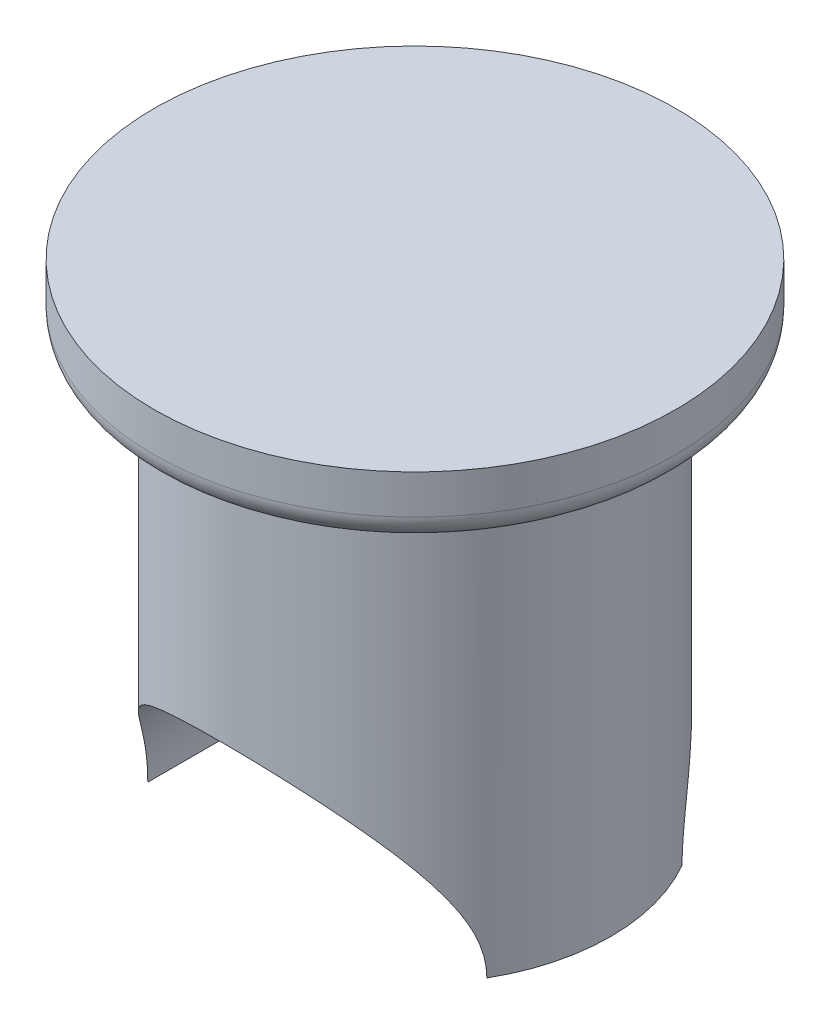
ISO-10303-21;
HEADER;
FILE_DESCRIPTION(('STEP AP214'),'2;1');
FILE_NAME('part.step','',(''),(''),'','','');
FILE_SCHEMA(('AUTOMOTIVE_DESIGN { 1 0 10303 214 1 1 1 1 }'));
ENDSEC;
DATA;
#1=APPLICATION_CONTEXT('core data for automotive mechanical design processes');
#2=APPLICATION_PROTOCOL_DEFINITION('international standard','automotive_design',2000,#1);
#3=PRODUCT_CONTEXT('',#1,'mechanical');
#4=PRODUCT('Part','Part','',(#3));
#5=PRODUCT_RELATED_PRODUCT_CATEGORY('part','',(#4));
#6=PRODUCT_DEFINITION_FORMATION('','',#4);
#7=PRODUCT_DEFINITION_CONTEXT('part definition',#1,'design');
#8=PRODUCT_DEFINITION('design','',#6,#7);
#9=PRODUCT_DEFINITION_SHAPE('','',#8);
#10=(LENGTH_UNIT() NAMED_UNIT(*) SI_UNIT(.MILLI.,.METRE.));
#11=(NAMED_UNIT(*) PLANE_ANGLE_UNIT() SI_UNIT($,.RADIAN.));
#12=(NAMED_UNIT(*) SI_UNIT($,.STERADIAN.) SOLID_ANGLE_UNIT());
#13=UNCERTAINTY_MEASURE_WITH_UNIT(LENGTH_MEASURE(1.E-05),#10,'distance_accuracy_value','');
#14=(GEOMETRIC_REPRESENTATION_CONTEXT(3) GLOBAL_UNCERTAINTY_ASSIGNED_CONTEXT((#13)) GLOBAL_UNIT_ASSIGNED_CONTEXT((#10,
#11,#12)) REPRESENTATION_CONTEXT('',''));
#15=CARTESIAN_POINT('',(0.,0.,0.));
#16=DIRECTION('',(0.,0.,1.));
#17=DIRECTION('',(1.,0.,0.));
#18=AXIS2_PLACEMENT_3D('',#15,#16,#17);
#19=CARTESIAN_POINT('',(0.,32.5,0.));
#20=DIRECTION('',(0.,-1.,0.));
#21=DIRECTION('',(0.,0.,-1.));
#22=AXIS2_PLACEMENT_3D('',#19,#20,#21);
#23=CYLINDRICAL_SURFACE('',#22,15.);
#24=CARTESIAN_POINT('',(0.,30.5,0.));
#25=DIRECTION('',(0.,1.,0.));
#26=DIRECTION('',(0.,0.,1.));
#27=AXIS2_PLACEMENT_3D('',#24,#25,#26);
#28=CIRCLE('',#27,15.);
#29=CARTESIAN_POINT('',(0.,30.5,15.));
#30=VERTEX_POINT('',#29);
#31=EDGE_CURVE('E11',#30,#30,#28,.F.);
#32=ORIENTED_EDGE('',*,*,#31,.T.);
#33=EDGE_LOOP('',(#32));
#34=FACE_BOUND('',#33,.T.);
#35=CARTESIAN_POINT('',(-13.,0.,-7.48331477354788));
#36=CARTESIAN_POINT('',(-13.0000020955869,0.1080174113842,-7.48330637784396));
#37=CARTESIAN_POINT('',(-12.9986532797851,0.216016152346618,-7.48565478784518));
#38=CARTESIAN_POINT('',(-12.9932767527423,0.431728540631945,-7.49498515855125));
#39=CARTESIAN_POINT('',(-12.9892494990905,0.539442233497736,-7.50196632778654));
#40=CARTESIAN_POINT('',(-12.9732100700489,0.861311729465134,-7.52969467058867));
#41=CARTESIAN_POINT('',(-12.9572399819306,1.07472871024008,-7.55722747523301));
#42=CARTESIAN_POINT('',(-12.915534604569,1.49422933930612,-7.62827668616808));
#43=CARTESIAN_POINT('',(-12.8899620520704,1.70037579240445,-7.67152635914249));
#44=CARTESIAN_POINT('',(-12.8296167032746,2.10793993488007,-7.77202467818089));
#45=CARTESIAN_POINT('',(-12.7948380964328,2.30935454996199,-7.82928216375834));
#46=CARTESIAN_POINT('',(-12.6994583425996,2.79445227106963,-7.9834310207218));
#47=CARTESIAN_POINT('',(-12.6342349665839,3.07521046266448,-8.08666156412358));
#48=CARTESIAN_POINT('',(-12.4876263289262,3.62494514274285,-8.3112677271785));
#49=CARTESIAN_POINT('',(-12.4062335740711,3.89391609798169,-8.4326517530471));
#50=CARTESIAN_POINT('',(-12.2277172099429,4.4228425840793,-8.68951138869974));
#51=CARTESIAN_POINT('',(-12.1304578559195,4.68269445038894,-8.82510462469558));
#52=CARTESIAN_POINT('',(-11.9215962992647,5.19144809055694,-9.10527994774321));
#53=CARTESIAN_POINT('',(-11.8099948161091,5.44035041286121,-9.24986158370242));
#54=CARTESIAN_POINT('',(-11.5073569507052,6.06285409978271,-9.62636491217878));
#55=CARTESIAN_POINT('',(-11.3065304736468,6.42926780697262,-9.86235699765509));
#56=CARTESIAN_POINT('',(-10.8722743220716,7.1391004730547,-10.3391433939227));
#57=CARTESIAN_POINT('',(-10.6388280453324,7.48250758997092,-10.5799400962443));
#58=CARTESIAN_POINT('',(-10.1400831252867,8.14557136753477,-11.0588410886802));
#59=CARTESIAN_POINT('',(-9.8748675604438,8.4652865831175,-11.2969506935712));
#60=CARTESIAN_POINT('',(-9.31194088541963,9.0808349755304,-11.7652777696195));
#61=CARTESIAN_POINT('',(-9.01424389844548,9.37667843544,-11.9954986141115));
#62=CARTESIAN_POINT('',(-8.45726057504844,9.87833953856848,-12.3920828752518));
#63=CARTESIAN_POINT('',(-8.20454468680972,10.0893715358176,-12.5611000175196));
#64=CARTESIAN_POINT('',(-7.67952003583313,10.494517501197,-12.8887818660794));
#65=CARTESIAN_POINT('',(-7.40721183619045,10.6886319551938,-13.0474468696485));
#66=CARTESIAN_POINT('',(-6.8436081678999,11.0579569578863,-13.3516843531264));
#67=CARTESIAN_POINT('',(-6.55233355658343,11.2331877279794,-13.4972708096863));
#68=CARTESIAN_POINT('',(-5.95123423900904,11.5628819421987,-13.7728738985243));
#69=CARTESIAN_POINT('',(-5.64141322436377,11.7173494994525,-13.9028936139658));
#70=CARTESIAN_POINT('',(-5.06320651099607,11.9768533701863,-14.1223637016087));
#71=CARTESIAN_POINT('',(-4.7977113557178,12.0857527757465,-14.214874332329));
#72=CARTESIAN_POINT('',(-4.25624117197239,12.2868946725919,-14.386278505312));
#73=CARTESIAN_POINT('',(-3.98026827305725,12.3791405269301,-14.4651747967404));
#74=CARTESIAN_POINT('',(-3.41927054645261,12.5456829492298,-14.6079541247077));
#75=CARTESIAN_POINT('',(-3.13424932203861,12.6199865632696,-14.6718430545027));
#76=CARTESIAN_POINT('',(-2.55676708403236,12.7495292434178,-14.7834167859026));
#77=CARTESIAN_POINT('',(-2.26430598775666,12.8047680975495,-14.8311014073353));
#78=CARTESIAN_POINT('',(-1.67250299104462,12.8954563623608,-14.9094691531993));
#79=CARTESIAN_POINT('',(-1.37313351837232,12.9308029547809,-14.9400639384793));
#80=CARTESIAN_POINT('',(-0.771357807424734,12.9806068284324,-14.9831905127601));
#81=CARTESIAN_POINT('',(-0.468951562375277,12.9950640630553,-14.9957222614584));
#82=CARTESIAN_POINT('',(0.13630013436705,13.0028078311809,-15.0024333990084));
#83=CARTESIAN_POINT('',(0.439145530689934,12.9960968349472,-14.9966149292705));
#84=CARTESIAN_POINT('',(1.04271822315129,12.9616395805387,-14.966764049341));
#85=CARTESIAN_POINT('',(1.34344562191994,12.9338943487809,-14.9427325278996));
#86=CARTESIAN_POINT('',(1.91599296224235,12.8610015635056,-14.8796860873697));
#87=CARTESIAN_POINT('',(2.18817237178999,12.8174554807157,-14.8420509823106));
#88=CARTESIAN_POINT('',(2.72693913824637,12.7137348331824,-14.7525714826664));
#89=CARTESIAN_POINT('',(2.99352686564266,12.6535613738858,-14.7007280327041));
#90=CARTESIAN_POINT('',(3.51960834251007,12.5174352247164,-14.5837229569458));
#91=CARTESIAN_POINT('',(3.77910270792276,12.4414839098471,-14.5185624917048));
#92=CARTESIAN_POINT('',(4.28988956736573,12.2747327035457,-14.3759242433201));
#93=CARTESIAN_POINT('',(4.54117895093819,12.1839272576352,-14.298441852881));
#94=CARTESIAN_POINT('',(5.052165283768,11.9815048167965,-14.1263377153992));
#95=CARTESIAN_POINT('',(5.31117601029757,11.8688632474575,-14.030886018557));
#96=CARTESIAN_POINT('',(5.81777705107139,11.6289324743418,-13.8285182066445));
#97=CARTESIAN_POINT('',(6.06536282729636,11.5016375191763,-13.7215975912049));
#98=CARTESIAN_POINT('',(6.54847410088973,11.2336020432997,-13.4977175721507));
#99=CARTESIAN_POINT('',(6.78399706742651,11.0928587186658,-13.3807560755774));
#100=CARTESIAN_POINT('',(7.24259135098254,10.7990305865094,-13.1381959654222));
#101=CARTESIAN_POINT('',(7.46566009981316,10.6459432493151,-13.0125955822432));
#102=CARTESIAN_POINT('',(8.0099177304633,10.2472457054968,-12.6880480113289));
#103=CARTESIAN_POINT('',(8.32300304497357,9.99432817966541,-12.4844153944793));
#104=CARTESIAN_POINT('',(8.92013481133766,9.46522466662813,-12.0650081617489));
#105=CARTESIAN_POINT('',(9.20416772090788,9.18902793664447,-11.8492279554772));
#106=CARTESIAN_POINT('',(9.74392127682738,8.61462124747115,-11.4095321981606));
#107=CARTESIAN_POINT('',(9.9995721836916,8.3163599400642,-11.1855983283412));
#108=CARTESIAN_POINT('',(10.4819430709959,7.69949260887711,-10.7348837141358));
#109=CARTESIAN_POINT('',(10.7086712324097,7.3808923765133,-10.508103794796));
#110=CARTESIAN_POINT('',(11.0961601980769,6.78081739022937,-10.0965618820599));
#111=CARTESIAN_POINT('',(11.2615242775592,6.50258867567891,-9.91138479113548));
#112=CARTESIAN_POINT('',(11.5724303422743,5.93165904796553,-9.54653175817499));
#113=CARTESIAN_POINT('',(11.7179679918252,5.63895498832025,-9.36685702604334));
#114=CARTESIAN_POINT('',(11.9882481358557,5.03884055528815,-9.01833585750503));
#115=CARTESIAN_POINT('',(12.1130384100104,4.73146613021063,-8.84946510846508));
#116=CARTESIAN_POINT('',(12.3409308765301,4.10048642815127,-8.52877951432833));
#117=CARTESIAN_POINT('',(12.444049831504,3.77689393746969,-8.37695152944318));
#118=CARTESIAN_POINT('',(12.6424841587623,3.05459234392005,-8.07499742281192));
#119=CARTESIAN_POINT('',(12.7334092080889,2.65253419978329,-7.9296525049501));
#120=CARTESIAN_POINT('',(12.8416238376061,2.03381009295956,-7.75226033909025));
#121=CARTESIAN_POINT('',(12.8729707023093,1.82532627926807,-7.69995452183738));
#122=CARTESIAN_POINT('',(12.9257210106453,1.40383862679279,-7.61107111241696));
#123=CARTESIAN_POINT('',(12.9471309229168,1.19083782313797,-7.57448328949485));
#124=CARTESIAN_POINT('',(12.9754377076508,0.814975335974051,-7.52586378273063));
#125=CARTESIAN_POINT('',(12.9846166676503,0.652774551115708,-7.50999305172081));
#126=CARTESIAN_POINT('',(12.9969135495595,0.327066389044968,-7.48867645634694));
#127=CARTESIAN_POINT('',(13.0000165857932,0.16355678588267,-7.48325619555099));
#128=CARTESIAN_POINT('',(13.,0.,-7.48331477354788));
#129=B_SPLINE_CURVE_WITH_KNOTS('',3,(#35,#36,#37,#38,#39,#40,#41,#42,#43,#44,#45,#46,#47,#48,
#49,#50,#51,#52,#53,#54,#55,#56,#57,#58,#59,#60,#61,#62,#63,#64,#65,#66,#67,#68,#69,#70,#71,#72,
#73,#74,#75,#76,#77,#78,#79,#80,#81,#82,#83,#84,#85,#86,#87,#88,#89,#90,#91,#92,#93,#94,#95,#96,
#97,#98,#99,#100,#101,#102,#103,#104,#105,#106,#107,#108,#109,#110,#111,#112,#113,#114,#115,
#116,#117,#118,#119,#120,#121,#122,#123,#124,#125,#126,#127,#128),.UNSPECIFIED.,.F.,.F.,(4,2,2,
2,2,2,2,2,2,2,2,2,2,2,2,2,2,2,2,2,2,2,2,2,2,2,2,2,2,2,2,2,2,2,2,2,2,2,2,2,2,2,2,2,2,2,4),(0.,
0.32398244554155,0.647909555538614,1.29417257498121,1.92994418139799,2.56611802575688,
3.48307116427912,4.40045023264482,5.32613459210718,6.25177253254168,7.68947049574091,
9.12790287536241,10.5626525855399,11.9967809214684,13.1061098931305,14.215406994715,
15.3235041593383,16.4313814888516,17.3350231429659,18.2384821091662,19.1415856998186,
20.0446993315529,20.9524390460725,21.8601807859481,22.7678165992482,23.6754081250965,
24.5090768631522,25.3426901892911,26.1762308984185,27.010084013038,27.9036396296678,
28.7975471664699,29.6916414872166,30.5859195036232,31.9371392919373,33.2889860851777,
34.644084326791,35.9987984167272,37.116695163637,38.2348359832685,39.3503650273463,
40.4650280159046,41.7713469777572,42.422320410642,43.0728694842046,43.5621410175258,
44.0526097465089),.UNSPECIFIED.);
#130=CARTESIAN_POINT('',(-13.,0.,-7.48331477354788));
#131=VERTEX_POINT('',#130);
#132=CARTESIAN_POINT('',(13.,0.,-7.48331477354788));
#133=VERTEX_POINT('',#132);
#134=EDGE_CURVE('E60',#131,#133,#129,.T.);
#135=ORIENTED_EDGE('',*,*,#134,.F.);
#136=CARTESIAN_POINT('',(0.,0.,0.));
#137=DIRECTION('',(0.,1.,0.));
#138=DIRECTION('',(0.,0.,1.));
#139=AXIS2_PLACEMENT_3D('',#136,#137,#138);
#140=CIRCLE('',#139,15.);
#141=CARTESIAN_POINT('',(-13.,0.,7.48331477354788));
#142=VERTEX_POINT('',#141);
#143=EDGE_CURVE('E76',#131,#142,#140,.T.);
#144=ORIENTED_EDGE('',*,*,#143,.T.);
#145=CARTESIAN_POINT('',(13.,0.,7.48331477354788));
#146=CARTESIAN_POINT('',(13.0000020955869,0.1080174113842,7.48330637784396));
#147=CARTESIAN_POINT('',(12.9986532797851,0.216016152346618,7.48565478784518));
#148=CARTESIAN_POINT('',(12.9932767527423,0.431728540631945,7.49498515855125));
#149=CARTESIAN_POINT('',(12.9892494990905,0.539442233497736,7.50196632778654));
#150=CARTESIAN_POINT('',(12.9732100700489,0.861311729465134,7.52969467058867));
#151=CARTESIAN_POINT('',(12.9572399819306,1.07472871024008,7.55722747523301));
#152=CARTESIAN_POINT('',(12.915534604569,1.49422933930612,7.62827668616808));
#153=CARTESIAN_POINT('',(12.8899620520704,1.70037579240445,7.67152635914249));
#154=CARTESIAN_POINT('',(12.8296167032746,2.10793993488007,7.77202467818089));
#155=CARTESIAN_POINT('',(12.7948380964328,2.30935454996199,7.82928216375834));
#156=CARTESIAN_POINT('',(12.6994583425996,2.79445227106963,7.9834310207218));
#157=CARTESIAN_POINT('',(12.6342349665839,3.07521046266448,8.08666156412358));
#158=CARTESIAN_POINT('',(12.4876263289262,3.62494514274285,8.3112677271785));
#159=CARTESIAN_POINT('',(12.4062335740711,3.89391609798169,8.4326517530471));
#160=CARTESIAN_POINT('',(12.2277172099429,4.4228425840793,8.68951138869974));
#161=CARTESIAN_POINT('',(12.1304578559195,4.68269445038894,8.82510462469558));
#162=CARTESIAN_POINT('',(11.9215962992647,5.19144809055694,9.10527994774321));
#163=CARTESIAN_POINT('',(11.8099948161091,5.44035041286121,9.24986158370242));
#164=CARTESIAN_POINT('',(11.5073569507052,6.06285409978271,9.62636491217878));
#165=CARTESIAN_POINT('',(11.3065304736468,6.42926780697262,9.86235699765509));
#166=CARTESIAN_POINT('',(10.8722743220716,7.1391004730547,10.3391433939227));
#167=CARTESIAN_POINT('',(10.6388280453324,7.48250758997092,10.5799400962443));
#168=CARTESIAN_POINT('',(10.1400831252867,8.14557136753477,11.0588410886802));
#169=CARTESIAN_POINT('',(9.8748675604438,8.4652865831175,11.2969506935712));
#170=CARTESIAN_POINT('',(9.31194088541963,9.0808349755304,11.7652777696195));
#171=CARTESIAN_POINT('',(9.01424389844548,9.37667843544,11.9954986141115));
#172=CARTESIAN_POINT('',(8.45726057504844,9.87833953856848,12.3920828752518));
#173=CARTESIAN_POINT('',(8.20454468680972,10.0893715358176,12.5611000175196));
#174=CARTESIAN_POINT('',(7.67952003583313,10.494517501197,12.8887818660794));
#175=CARTESIAN_POINT('',(7.40721183619045,10.6886319551938,13.0474468696485));
#176=CARTESIAN_POINT('',(6.8436081678999,11.0579569578863,13.3516843531264));
#177=CARTESIAN_POINT('',(6.55233355658343,11.2331877279794,13.4972708096863));
#178=CARTESIAN_POINT('',(5.95123423900904,11.5628819421987,13.7728738985243));
#179=CARTESIAN_POINT('',(5.64141322436377,11.7173494994525,13.9028936139658));
#180=CARTESIAN_POINT('',(5.06320651099607,11.9768533701863,14.1223637016087));
#181=CARTESIAN_POINT('',(4.7977113557178,12.0857527757465,14.214874332329));
#182=CARTESIAN_POINT('',(4.25624117197239,12.2868946725919,14.386278505312));
#183=CARTESIAN_POINT('',(3.98026827305725,12.3791405269301,14.4651747967404));
#184=CARTESIAN_POINT('',(3.41927054645261,12.5456829492298,14.6079541247077));
#185=CARTESIAN_POINT('',(3.13424932203861,12.6199865632696,14.6718430545027));
#186=CARTESIAN_POINT('',(2.55676708403236,12.7495292434178,14.7834167859026));
#187=CARTESIAN_POINT('',(2.26430598775666,12.8047680975495,14.8311014073353));
#188=CARTESIAN_POINT('',(1.67250299104462,12.8954563623608,14.9094691531993));
#189=CARTESIAN_POINT('',(1.37313351837232,12.9308029547809,14.9400639384793));
#190=CARTESIAN_POINT('',(0.771357807424734,12.9806068284324,14.9831905127601));
#191=CARTESIAN_POINT('',(0.468951562375277,12.9950640630553,14.9957222614584));
#192=CARTESIAN_POINT('',(-0.13630013436705,13.0028078311809,15.0024333990084));
#193=CARTESIAN_POINT('',(-0.439145530689934,12.9960968349472,14.9966149292705));
#194=CARTESIAN_POINT('',(-1.04271822315129,12.9616395805387,14.966764049341));
#195=CARTESIAN_POINT('',(-1.34344562191994,12.9338943487809,14.9427325278996));
#196=CARTESIAN_POINT('',(-1.91599296224235,12.8610015635056,14.8796860873697));
#197=CARTESIAN_POINT('',(-2.18817237178999,12.8174554807157,14.8420509823106));
#198=CARTESIAN_POINT('',(-2.72693913824637,12.7137348331824,14.7525714826664));
#199=CARTESIAN_POINT('',(-2.99352686564266,12.6535613738858,14.7007280327041));
#200=CARTESIAN_POINT('',(-3.51960834251007,12.5174352247164,14.5837229569458));
#201=CARTESIAN_POINT('',(-3.77910270792276,12.4414839098471,14.5185624917048));
#202=CARTESIAN_POINT('',(-4.28988956736573,12.2747327035457,14.3759242433201));
#203=CARTESIAN_POINT('',(-4.54117895093819,12.1839272576352,14.298441852881));
#204=CARTESIAN_POINT('',(-5.052165283768,11.9815048167965,14.1263377153992));
#205=CARTESIAN_POINT('',(-5.31117601029757,11.8688632474575,14.030886018557));
#206=CARTESIAN_POINT('',(-5.81777705107139,11.6289324743418,13.8285182066445));
#207=CARTESIAN_POINT('',(-6.06536282729636,11.5016375191763,13.7215975912049));
#208=CARTESIAN_POINT('',(-6.54847410088973,11.2336020432997,13.4977175721507));
#209=CARTESIAN_POINT('',(-6.78399706742651,11.0928587186658,13.3807560755774));
#210=CARTESIAN_POINT('',(-7.24259135098254,10.7990305865094,13.1381959654222));
#211=CARTESIAN_POINT('',(-7.46566009981316,10.6459432493151,13.0125955822432));
#212=CARTESIAN_POINT('',(-8.0099177304633,10.2472457054968,12.6880480113289));
#213=CARTESIAN_POINT('',(-8.32300304497357,9.99432817966541,12.4844153944793));
#214=CARTESIAN_POINT('',(-8.92013481133766,9.46522466662813,12.0650081617489));
#215=CARTESIAN_POINT('',(-9.20416772090788,9.18902793664447,11.8492279554772));
#216=CARTESIAN_POINT('',(-9.74392127682738,8.61462124747115,11.4095321981606));
#217=CARTESIAN_POINT('',(-9.9995721836916,8.3163599400642,11.1855983283412));
#218=CARTESIAN_POINT('',(-10.4819430709959,7.69949260887711,10.7348837141358));
#219=CARTESIAN_POINT('',(-10.7086712324097,7.3808923765133,10.508103794796));
#220=CARTESIAN_POINT('',(-11.0961601980769,6.78081739022937,10.0965618820599));
#221=CARTESIAN_POINT('',(-11.2615242775592,6.50258867567891,9.91138479113548));
#222=CARTESIAN_POINT('',(-11.5724303422743,5.93165904796553,9.54653175817499));
#223=CARTESIAN_POINT('',(-11.7179679918252,5.63895498832025,9.36685702604334));
#224=CARTESIAN_POINT('',(-11.9882481358557,5.03884055528815,9.01833585750503));
#225=CARTESIAN_POINT('',(-12.1130384100104,4.73146613021063,8.84946510846508));
#226=CARTESIAN_POINT('',(-12.3409308765301,4.10048642815127,8.52877951432833));
#227=CARTESIAN_POINT('',(-12.444049831504,3.77689393746969,8.37695152944318));
#228=CARTESIAN_POINT('',(-12.6424841587623,3.05459234392005,8.07499742281192));
#229=CARTESIAN_POINT('',(-12.7334092080889,2.65253419978329,7.9296525049501));
#230=CARTESIAN_POINT('',(-12.8416238376061,2.03381009295956,7.75226033909025));
#231=CARTESIAN_POINT('',(-12.8729707023093,1.82532627926807,7.69995452183738));
#232=CARTESIAN_POINT('',(-12.9257210106453,1.40383862679279,7.61107111241696));
#233=CARTESIAN_POINT('',(-12.9471309229168,1.19083782313797,7.57448328949485));
#234=CARTESIAN_POINT('',(-12.9754377076508,0.814975335974051,7.52586378273063));
#235=CARTESIAN_POINT('',(-12.9846166676503,0.652774551115708,7.50999305172081));
#236=CARTESIAN_POINT('',(-12.9969135495595,0.327066389044968,7.48867645634694));
#237=CARTESIAN_POINT('',(-13.0000165857932,0.16355678588267,7.48325619555099));
#238=CARTESIAN_POINT('',(-13.,0.,7.48331477354788));
#239=B_SPLINE_CURVE_WITH_KNOTS('',3,(#145,#146,#147,#148,#149,#150,#151,#152,#153,#154,#155,
#156,#157,#158,#159,#160,#161,#162,#163,#164,#165,#166,#167,#168,#169,#170,#171,#172,#173,#174,
#175,#176,#177,#178,#179,#180,#181,#182,#183,#184,#185,#186,#187,#188,#189,#190,#191,#192,#193,
#194,#195,#196,#197,#198,#199,#200,#201,#202,#203,#204,#205,#206,#207,#208,#209,#210,#211,#212,
#213,#214,#215,#216,#217,#218,#219,#220,#221,#222,#223,#224,#225,#226,#227,#228,#229,#230,#231,
#232,#233,#234,#235,#236,#237,#238),.UNSPECIFIED.,.F.,.F.,(4,2,2,2,2,2,2,2,2,2,2,2,2,2,2,2,2,2,
2,2,2,2,2,2,2,2,2,2,2,2,2,2,2,2,2,2,2,2,2,2,2,2,2,2,2,2,4),(0.,0.32398244554155,
0.647909555538614,1.29417257498121,1.92994418139799,2.56611802575688,3.48307116427912,
4.40045023264482,5.32613459210718,6.25177253254168,7.68947049574091,9.12790287536241,
10.5626525855399,11.9967809214684,13.1061098931305,14.215406994715,15.3235041593383,
16.4313814888516,17.3350231429659,18.2384821091662,19.1415856998186,20.0446993315529,
20.9524390460725,21.8601807859481,22.7678165992482,23.6754081250965,24.5090768631522,
25.3426901892911,26.1762308984185,27.010084013038,27.9036396296678,28.7975471664699,
29.6916414872166,30.5859195036232,31.9371392919373,33.2889860851777,34.644084326791,
35.9987984167272,37.116695163637,38.2348359832685,39.3503650273463,40.4650280159046,
41.7713469777572,42.422320410642,43.0728694842046,43.5621410175258,44.0526097465089),.UNSPECIFIED.);
#240=CARTESIAN_POINT('',(13.,0.,7.48331477354788));
#241=VERTEX_POINT('',#240);
#242=EDGE_CURVE('E55',#241,#142,#239,.T.);
#243=ORIENTED_EDGE('',*,*,#242,.F.);
#244=EDGE_CURVE('E72',#241,#133,#140,.T.);
#245=ORIENTED_EDGE('',*,*,#244,.T.);
#246=EDGE_LOOP('',(#135,#144,#243,#245));
#247=FACE_BOUND('',#246,.T.);
#248=ADVANCED_FACE('F39',(#34,#247),#23,.T.);
#249=CARTESIAN_POINT('',(0.,0.,0.));
#250=DIRECTION('',(0.,1.,0.));
#251=DIRECTION('',(0.,0.,1.));
#252=AXIS2_PLACEMENT_3D('',#249,#250,#251);
#253=PLANE('',#252);
#254=DIRECTION('',(0.,0.,-1.));
#255=VECTOR('',#254,1.);
#256=CARTESIAN_POINT('',(13.,0.,50.));
#257=LINE('',#256,#255);
#258=EDGE_CURVE('E71',#133,#241,#257,.F.);
#259=ORIENTED_EDGE('',*,*,#258,.F.);
#260=ORIENTED_EDGE('',*,*,#244,.F.);
#261=EDGE_LOOP('',(#259,#260));
#262=FACE_BOUND('',#261,.T.);
#263=ADVANCED_FACE('F134',(#262),#253,.F.);
#264=DIRECTION('',(0.,0.,-1.));
#265=VECTOR('',#264,1.);
#266=CARTESIAN_POINT('',(-13.,0.,50.));
#267=LINE('',#266,#265);
#268=EDGE_CURVE('E65',#142,#131,#267,.T.);
#269=ORIENTED_EDGE('',*,*,#268,.F.);
#270=ORIENTED_EDGE('',*,*,#143,.F.);
#271=EDGE_LOOP('',(#269,#270));
#272=FACE_BOUND('',#271,.T.);
#273=ADVANCED_FACE('F80',(#272),#253,.F.);
#274=CARTESIAN_POINT('',(0.,0.,50.));
#275=DIRECTION('',(0.,0.,-1.));
#276=DIRECTION('',(-1.,0.,0.));
#277=AXIS2_PLACEMENT_3D('',#274,#275,#276);
#278=CYLINDRICAL_SURFACE('',#277,13.);
#279=ORIENTED_EDGE('',*,*,#258,.T.);
#280=ORIENTED_EDGE('',*,*,#242,.T.);
#281=ORIENTED_EDGE('',*,*,#268,.T.);
#282=ORIENTED_EDGE('',*,*,#134,.T.);
#283=EDGE_LOOP('',(#279,#280,#281,#282));
#284=FACE_BOUND('',#283,.T.);
#285=ADVANCED_FACE('F66',(#284),#278,.F.);
#286=CARTESIAN_POINT('',(0.,37.5,0.));
#287=DIRECTION('',(0.,-1.,0.));
#288=DIRECTION('',(0.,0.,-1.));
#289=AXIS2_PLACEMENT_3D('',#286,#287,#288);
#290=CYLINDRICAL_SURFACE('',#289,20.);
#291=CARTESIAN_POINT('',(0.,34.5,0.));
#292=DIRECTION('',(0.,1.,0.));
#293=DIRECTION('',(0.,0.,1.));
#294=AXIS2_PLACEMENT_3D('',#291,#292,#293);
#295=CIRCLE('',#294,20.);
#296=CARTESIAN_POINT('',(0.,34.5,20.));
#297=VERTEX_POINT('',#296);
#298=EDGE_CURVE('E94',#297,#297,#295,.T.);
#299=ORIENTED_EDGE('',*,*,#298,.T.);
#300=EDGE_LOOP('',(#299));
#301=FACE_BOUND('',#300,.T.);
#302=CARTESIAN_POINT('',(0.,37.5,0.));
#303=DIRECTION('',(0.,1.,0.));
#304=DIRECTION('',(0.,0.,1.));
#305=AXIS2_PLACEMENT_3D('',#302,#303,#304);
#306=CIRCLE('',#305,20.);
#307=CARTESIAN_POINT('',(0.,37.5,20.));
#308=VERTEX_POINT('',#307);
#309=EDGE_CURVE('E120',#308,#308,#306,.T.);
#310=ORIENTED_EDGE('',*,*,#309,.F.);
#311=EDGE_LOOP('',(#310));
#312=FACE_BOUND('',#311,.T.);
#313=ADVANCED_FACE('F113',(#301,#312),#290,.T.);
#314=CARTESIAN_POINT('',(0.,37.5,0.));
#315=DIRECTION('',(0.,1.,0.));
#316=DIRECTION('',(0.,0.,1.));
#317=AXIS2_PLACEMENT_3D('',#314,#315,#316);
#318=PLANE('',#317);
#319=ORIENTED_EDGE('',*,*,#309,.T.);
#320=EDGE_LOOP('',(#319));
#321=FACE_BOUND('',#320,.T.);
#322=ADVANCED_FACE('F116',(#321),#318,.T.);
#323=CARTESIAN_POINT('',(0.,32.5,0.));
#324=DIRECTION('',(0.,1.,0.));
#325=DIRECTION('',(0.,0.,1.));
#326=AXIS2_PLACEMENT_3D('',#323,#324,#325);
#327=PLANE('',#326);
#328=CARTESIAN_POINT('',(0.,32.5,0.));
#329=DIRECTION('',(0.,1.,0.));
#330=DIRECTION('',(0.,0.,1.));
#331=AXIS2_PLACEMENT_3D('',#328,#329,#330);
#332=CIRCLE('',#331,18.);
#333=CARTESIAN_POINT('',(0.,32.5,18.));
#334=VERTEX_POINT('',#333);
#335=EDGE_CURVE('E48',#334,#334,#332,.F.);
#336=ORIENTED_EDGE('',*,*,#335,.T.);
#337=EDGE_LOOP('',(#336));
#338=FACE_BOUND('',#337,.T.);
#339=CARTESIAN_POINT('',(0.,32.5,0.));
#340=DIRECTION('',(0.,1.,0.));
#341=DIRECTION('',(0.,0.,1.));
#342=AXIS2_PLACEMENT_3D('',#339,#340,#341);
#343=CIRCLE('',#342,17.);
#344=CARTESIAN_POINT('',(0.,32.5,17.));
#345=VERTEX_POINT('',#344);
#346=EDGE_CURVE('E98',#345,#345,#343,.T.);
#347=ORIENTED_EDGE('',*,*,#346,.T.);
#348=EDGE_LOOP('',(#347));
#349=FACE_BOUND('',#348,.T.);
#350=ADVANCED_FACE('F105',(#338,#349),#327,.F.);
#351=CARTESIAN_POINT('',(0.,34.5,0.));
#352=DIRECTION('',(0.,1.,0.));
#353=DIRECTION('',(0.,0.,1.));
#354=AXIS2_PLACEMENT_3D('',#351,#352,#353);
#355=TOROIDAL_SURFACE('',#354,18.,2.);
#356=ORIENTED_EDGE('',*,*,#335,.F.);
#357=EDGE_LOOP('',(#356));
#358=FACE_BOUND('',#357,.T.);
#359=ORIENTED_EDGE('',*,*,#298,.F.);
#360=EDGE_LOOP('',(#359));
#361=FACE_BOUND('',#360,.T.);
#362=ADVANCED_FACE('F108',(#358,#361),#355,.T.);
#363=CARTESIAN_POINT('',(0.,30.5,0.));
#364=DIRECTION('',(0.,1.,0.));
#365=DIRECTION('',(0.,0.,1.));
#366=AXIS2_PLACEMENT_3D('',#363,#364,#365);
#367=TOROIDAL_SURFACE('',#366,17.,2.);
#368=ORIENTED_EDGE('',*,*,#31,.F.);
#369=EDGE_LOOP('',(#368));
#370=FACE_BOUND('',#369,.T.);
#371=ORIENTED_EDGE('',*,*,#346,.F.);
#372=EDGE_LOOP('',(#371));
#373=FACE_BOUND('',#372,.T.);
#374=ADVANCED_FACE('F41',(#370,#373),#367,.F.);
#375=CLOSED_SHELL('',(#248,#263,#273,#285,#313,#322,#350,#362,#374));
#376=MANIFOLD_SOLID_BREP('B2',#375);
#377=ADVANCED_BREP_SHAPE_REPRESENTATION('',(#18,#376),#14);
#378=SHAPE_DEFINITION_REPRESENTATION(#9,#377);
ENDSEC;
END-ISO-10303-21;
